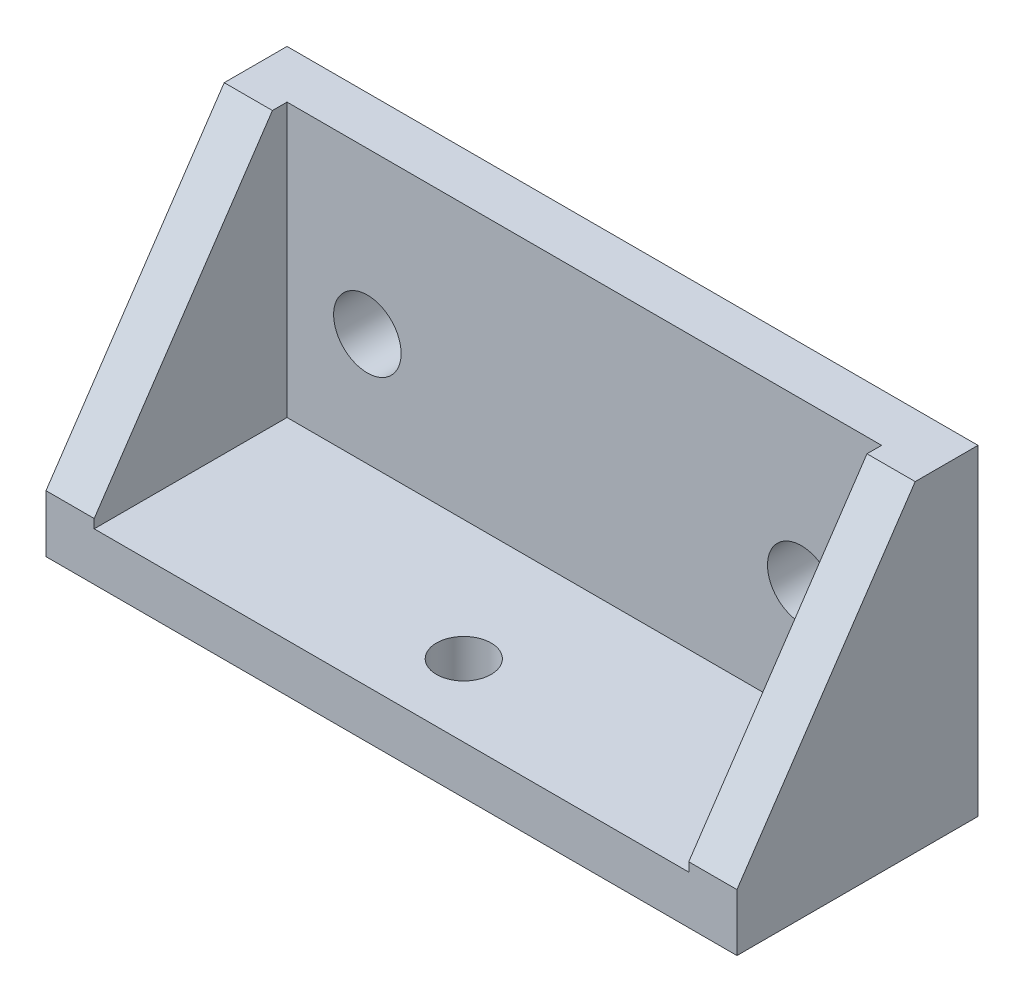
ISO-10303-21;
HEADER;
FILE_DESCRIPTION(('STEP AP214'),'2;1');
FILE_NAME('part.step','',(''),(''),'','','');
FILE_SCHEMA(('AUTOMOTIVE_DESIGN { 1 0 10303 214 1 1 1 1 }'));
ENDSEC;
DATA;
#1=APPLICATION_CONTEXT('core data for automotive mechanical design processes');
#2=APPLICATION_PROTOCOL_DEFINITION('international standard','automotive_design',2000,#1);
#3=PRODUCT_CONTEXT('',#1,'mechanical');
#4=PRODUCT('Part','Part','',(#3));
#5=PRODUCT_RELATED_PRODUCT_CATEGORY('part','',(#4));
#6=PRODUCT_DEFINITION_FORMATION('','',#4);
#7=PRODUCT_DEFINITION_CONTEXT('part definition',#1,'design');
#8=PRODUCT_DEFINITION('design','',#6,#7);
#9=PRODUCT_DEFINITION_SHAPE('','',#8);
#10=(LENGTH_UNIT() NAMED_UNIT(*) SI_UNIT(.MILLI.,.METRE.));
#11=(NAMED_UNIT(*) PLANE_ANGLE_UNIT() SI_UNIT($,.RADIAN.));
#12=(NAMED_UNIT(*) SI_UNIT($,.STERADIAN.) SOLID_ANGLE_UNIT());
#13=UNCERTAINTY_MEASURE_WITH_UNIT(LENGTH_MEASURE(1.E-05),#10,'distance_accuracy_value','');
#14=(GEOMETRIC_REPRESENTATION_CONTEXT(3) GLOBAL_UNCERTAINTY_ASSIGNED_CONTEXT((#13)) GLOBAL_UNIT_ASSIGNED_CONTEXT((#10,
#11,#12)) REPRESENTATION_CONTEXT('',''));
#15=CARTESIAN_POINT('',(0.,0.,0.));
#16=DIRECTION('',(0.,0.,1.));
#17=DIRECTION('',(1.,0.,0.));
#18=AXIS2_PLACEMENT_3D('',#15,#16,#17);
#19=CARTESIAN_POINT('',(21.5,20.,3.90885));
#20=DIRECTION('',(0.,-0.559192811985604,-0.829037634262542));
#21=DIRECTION('',(0.,0.829037634262542,-0.559192811985604));
#22=AXIS2_PLACEMENT_3D('',#19,#20,#21);
#23=PLANE('',#22);
#24=DIRECTION('',(-1.,0.,0.));
#25=VECTOR('',#24,1.);
#26=CARTESIAN_POINT('',(21.5,3.55669,15.));
#27=LINE('',#26,#25);
#28=CARTESIAN_POINT('',(-18.5,3.55669,15.));
#29=VERTEX_POINT('',#28);
#30=CARTESIAN_POINT('',(-21.5,3.55669,15.));
#31=VERTEX_POINT('',#30);
#32=EDGE_CURVE('E111',#29,#31,#27,.T.);
#33=ORIENTED_EDGE('',*,*,#32,.F.);
#34=DIRECTION('',(0.,0.829037634262542,-0.559192811985604));
#35=VECTOR('',#34,1.);
#36=CARTESIAN_POINT('',(-18.5,20.,3.90885));
#37=LINE('',#36,#35);
#38=CARTESIAN_POINT('',(-18.5,20.,3.90885));
#39=VERTEX_POINT('',#38);
#40=EDGE_CURVE('E124',#29,#39,#37,.T.);
#41=ORIENTED_EDGE('',*,*,#40,.T.);
#42=DIRECTION('',(-1.,0.,0.));
#43=VECTOR('',#42,1.);
#44=CARTESIAN_POINT('',(21.5,20.,3.90885));
#45=LINE('',#44,#43);
#46=CARTESIAN_POINT('',(-21.5,20.,3.90885));
#47=VERTEX_POINT('',#46);
#48=EDGE_CURVE('E40',#39,#47,#45,.T.);
#49=ORIENTED_EDGE('',*,*,#48,.T.);
#50=DIRECTION('',(0.,-0.829037634262543,0.559192811985604));
#51=VECTOR('',#50,1.);
#52=CARTESIAN_POINT('',(-21.5,20.,3.90885));
#53=LINE('',#52,#51);
#54=EDGE_CURVE('E123',#47,#31,#53,.T.);
#55=ORIENTED_EDGE('',*,*,#54,.T.);
#56=EDGE_LOOP('',(#33,#41,#49,#55));
#57=FACE_BOUND('',#56,.T.);
#58=ADVANCED_FACE('F32',(#57),#23,.F.);
#59=CARTESIAN_POINT('',(21.5,20.,0.));
#60=DIRECTION('',(0.,-1.,0.));
#61=DIRECTION('',(0.,0.,-1.));
#62=AXIS2_PLACEMENT_3D('',#59,#60,#61);
#63=PLANE('',#62);
#64=ORIENTED_EDGE('',*,*,#48,.F.);
#65=DIRECTION('',(0.,0.,1.));
#66=VECTOR('',#65,1.);
#67=CARTESIAN_POINT('',(-18.5,20.,3.));
#68=LINE('',#67,#66);
#69=CARTESIAN_POINT('',(-18.5,20.,3.));
#70=VERTEX_POINT('',#69);
#71=EDGE_CURVE('E174',#70,#39,#68,.T.);
#72=ORIENTED_EDGE('',*,*,#71,.F.);
#73=DIRECTION('',(-1.,0.,0.));
#74=VECTOR('',#73,1.);
#75=CARTESIAN_POINT('',(-18.5,20.,3.));
#76=LINE('',#75,#74);
#77=CARTESIAN_POINT('',(18.5,20.,3.));
#78=VERTEX_POINT('',#77);
#79=EDGE_CURVE('E168',#78,#70,#76,.T.);
#80=ORIENTED_EDGE('',*,*,#79,.F.);
#81=DIRECTION('',(0.,0.,-1.));
#82=VECTOR('',#81,1.);
#83=CARTESIAN_POINT('',(18.5,20.,3.));
#84=LINE('',#83,#82);
#85=CARTESIAN_POINT('',(18.5,20.,3.90885));
#86=VERTEX_POINT('',#85);
#87=EDGE_CURVE('E171',#86,#78,#84,.T.);
#88=ORIENTED_EDGE('',*,*,#87,.F.);
#89=CARTESIAN_POINT('',(21.5,20.,3.90885));
#90=VERTEX_POINT('',#89);
#91=EDGE_CURVE('E11',#90,#86,#45,.T.);
#92=ORIENTED_EDGE('',*,*,#91,.F.);
#93=DIRECTION('',(0.,0.,1.));
#94=VECTOR('',#93,1.);
#95=CARTESIAN_POINT('',(21.5,20.,0.));
#96=LINE('',#95,#94);
#97=CARTESIAN_POINT('',(21.5,20.,0.));
#98=VERTEX_POINT('',#97);
#99=EDGE_CURVE('E131',#98,#90,#96,.T.);
#100=ORIENTED_EDGE('',*,*,#99,.F.);
#101=DIRECTION('',(-1.,0.,0.));
#102=VECTOR('',#101,1.);
#103=CARTESIAN_POINT('',(21.5,20.,0.));
#104=LINE('',#103,#102);
#105=CARTESIAN_POINT('',(-21.5,20.,0.));
#106=VERTEX_POINT('',#105);
#107=EDGE_CURVE('E116',#98,#106,#104,.T.);
#108=ORIENTED_EDGE('',*,*,#107,.T.);
#109=DIRECTION('',(0.,0.,1.));
#110=VECTOR('',#109,1.);
#111=CARTESIAN_POINT('',(-21.5,20.,0.));
#112=LINE('',#111,#110);
#113=EDGE_CURVE('E120',#106,#47,#112,.T.);
#114=ORIENTED_EDGE('',*,*,#113,.T.);
#115=EDGE_LOOP('',(#64,#72,#80,#88,#92,#100,#108,#114));
#116=FACE_BOUND('',#115,.T.);
#117=ADVANCED_FACE('F34',(#116),#63,.F.);
#118=ORIENTED_EDGE('',*,*,#91,.T.);
#119=DIRECTION('',(0.,-0.829037634262542,0.559192811985604));
#120=VECTOR('',#119,1.);
#121=CARTESIAN_POINT('',(18.5,20.,3.90885));
#122=LINE('',#121,#120);
#123=CARTESIAN_POINT('',(18.5,3.55669,15.));
#124=VERTEX_POINT('',#123);
#125=EDGE_CURVE('E154',#86,#124,#122,.T.);
#126=ORIENTED_EDGE('',*,*,#125,.T.);
#127=CARTESIAN_POINT('',(21.5,3.55669,15.));
#128=VERTEX_POINT('',#127);
#129=EDGE_CURVE('E133',#128,#124,#27,.T.);
#130=ORIENTED_EDGE('',*,*,#129,.F.);
#131=DIRECTION('',(0.,-0.829037634262543,0.559192811985604));
#132=VECTOR('',#131,1.);
#133=CARTESIAN_POINT('',(21.5,20.,3.90885));
#134=LINE('',#133,#132);
#135=EDGE_CURVE('E88',#90,#128,#134,.T.);
#136=ORIENTED_EDGE('',*,*,#135,.F.);
#137=EDGE_LOOP('',(#118,#126,#130,#136));
#138=FACE_BOUND('',#137,.T.);
#139=ADVANCED_FACE('F226',(#138),#23,.F.);
#140=CARTESIAN_POINT('',(21.5,3.55669,15.));
#141=DIRECTION('',(0.,0.,-1.));
#142=DIRECTION('',(-1.,0.,0.));
#143=AXIS2_PLACEMENT_3D('',#140,#141,#142);
#144=PLANE('',#143);
#145=DIRECTION('',(1.,0.,0.));
#146=VECTOR('',#145,1.);
#147=CARTESIAN_POINT('',(-18.5,2.99999999999999,15.));
#148=LINE('',#147,#146);
#149=CARTESIAN_POINT('',(-18.5,2.99999999999999,15.));
#150=VERTEX_POINT('',#149);
#151=CARTESIAN_POINT('',(18.5,2.99999999999999,15.));
#152=VERTEX_POINT('',#151);
#153=EDGE_CURVE('E182',#150,#152,#148,.T.);
#154=ORIENTED_EDGE('',*,*,#153,.F.);
#155=DIRECTION('',(0.,1.,0.));
#156=VECTOR('',#155,1.);
#157=CARTESIAN_POINT('',(-18.5,2.99999999999999,15.));
#158=LINE('',#157,#156);
#159=EDGE_CURVE('E138',#150,#29,#158,.T.);
#160=ORIENTED_EDGE('',*,*,#159,.T.);
#161=ORIENTED_EDGE('',*,*,#32,.T.);
#162=DIRECTION('',(0.,-1.,0.));
#163=VECTOR('',#162,1.);
#164=CARTESIAN_POINT('',(-21.5,3.55669,15.));
#165=LINE('',#164,#163);
#166=CARTESIAN_POINT('',(-21.5,0.,15.));
#167=VERTEX_POINT('',#166);
#168=EDGE_CURVE('E108',#31,#167,#165,.T.);
#169=ORIENTED_EDGE('',*,*,#168,.T.);
#170=DIRECTION('',(-1.,0.,0.));
#171=VECTOR('',#170,1.);
#172=CARTESIAN_POINT('',(21.5,0.,15.));
#173=LINE('',#172,#171);
#174=CARTESIAN_POINT('',(21.5,0.,15.));
#175=VERTEX_POINT('',#174);
#176=EDGE_CURVE('E104',#175,#167,#173,.T.);
#177=ORIENTED_EDGE('',*,*,#176,.F.);
#178=DIRECTION('',(0.,-1.,0.));
#179=VECTOR('',#178,1.);
#180=CARTESIAN_POINT('',(21.5,3.55669,15.));
#181=LINE('',#180,#179);
#182=EDGE_CURVE('E94',#128,#175,#181,.T.);
#183=ORIENTED_EDGE('',*,*,#182,.F.);
#184=ORIENTED_EDGE('',*,*,#129,.T.);
#185=DIRECTION('',(0.,1.,0.));
#186=VECTOR('',#185,1.);
#187=CARTESIAN_POINT('',(18.5,2.99999999999999,15.));
#188=LINE('',#187,#186);
#189=EDGE_CURVE('E159',#152,#124,#188,.T.);
#190=ORIENTED_EDGE('',*,*,#189,.F.);
#191=EDGE_LOOP('',(#154,#160,#161,#169,#177,#183,#184,#190));
#192=FACE_BOUND('',#191,.T.);
#193=ADVANCED_FACE('F106',(#192),#144,.F.);
#194=CARTESIAN_POINT('',(21.5,0.,15.));
#195=DIRECTION('',(0.,1.,0.));
#196=DIRECTION('',(0.,0.,1.));
#197=AXIS2_PLACEMENT_3D('',#194,#195,#196);
#198=PLANE('',#197);
#199=CARTESIAN_POINT('',(0.,0.,10.5));
#200=DIRECTION('',(0.,1.,0.));
#201=DIRECTION('',(0.,0.,1.));
#202=AXIS2_PLACEMENT_3D('',#199,#200,#201);
#203=CIRCLE('',#202,1.7);
#204=CARTESIAN_POINT('',(0.,0.,12.2));
#205=VERTEX_POINT('',#204);
#206=EDGE_CURVE('E194',#205,#205,#203,.T.);
#207=ORIENTED_EDGE('',*,*,#206,.T.);
#208=EDGE_LOOP('',(#207));
#209=FACE_BOUND('',#208,.T.);
#210=DIRECTION('',(0.,0.,-1.));
#211=VECTOR('',#210,1.);
#212=CARTESIAN_POINT('',(-21.5,0.,15.));
#213=LINE('',#212,#211);
#214=CARTESIAN_POINT('',(-21.5,0.,0.));
#215=VERTEX_POINT('',#214);
#216=EDGE_CURVE('E128',#167,#215,#213,.T.);
#217=ORIENTED_EDGE('',*,*,#216,.T.);
#218=DIRECTION('',(-1.,0.,0.));
#219=VECTOR('',#218,1.);
#220=CARTESIAN_POINT('',(21.5,0.,0.));
#221=LINE('',#220,#219);
#222=CARTESIAN_POINT('',(21.5,0.,0.));
#223=VERTEX_POINT('',#222);
#224=EDGE_CURVE('E112',#223,#215,#221,.T.);
#225=ORIENTED_EDGE('',*,*,#224,.F.);
#226=DIRECTION('',(0.,0.,-1.));
#227=VECTOR('',#226,1.);
#228=CARTESIAN_POINT('',(21.5,0.,15.));
#229=LINE('',#228,#227);
#230=EDGE_CURVE('E98',#175,#223,#229,.T.);
#231=ORIENTED_EDGE('',*,*,#230,.F.);
#232=ORIENTED_EDGE('',*,*,#176,.T.);
#233=EDGE_LOOP('',(#217,#225,#231,#232));
#234=FACE_BOUND('',#233,.T.);
#235=ADVANCED_FACE('F114',(#209,#234),#198,.F.);
#236=CARTESIAN_POINT('',(21.5,0.,0.));
#237=DIRECTION('',(0.,0.,1.));
#238=DIRECTION('',(1.,0.,0.));
#239=AXIS2_PLACEMENT_3D('',#236,#237,#238);
#240=PLANE('',#239);
#241=CARTESIAN_POINT('',(13.5,10.,0.));
#242=DIRECTION('',(0.,0.,1.));
#243=DIRECTION('',(1.,0.,0.));
#244=AXIS2_PLACEMENT_3D('',#241,#242,#243);
#245=CIRCLE('',#244,2.1);
#246=CARTESIAN_POINT('',(15.6,10.,0.));
#247=VERTEX_POINT('',#246);
#248=EDGE_CURVE('E188',#247,#247,#245,.T.);
#249=ORIENTED_EDGE('',*,*,#248,.T.);
#250=EDGE_LOOP('',(#249));
#251=FACE_BOUND('',#250,.T.);
#252=CARTESIAN_POINT('',(-13.5,10.,0.));
#253=DIRECTION('',(0.,0.,1.));
#254=DIRECTION('',(1.,0.,0.));
#255=AXIS2_PLACEMENT_3D('',#252,#253,#254);
#256=CIRCLE('',#255,2.1);
#257=CARTESIAN_POINT('',(-11.4,10.,0.));
#258=VERTEX_POINT('',#257);
#259=EDGE_CURVE('E177',#258,#258,#256,.T.);
#260=ORIENTED_EDGE('',*,*,#259,.T.);
#261=EDGE_LOOP('',(#260));
#262=FACE_BOUND('',#261,.T.);
#263=DIRECTION('',(0.,1.,0.));
#264=VECTOR('',#263,1.);
#265=CARTESIAN_POINT('',(-21.5,0.,0.));
#266=LINE('',#265,#264);
#267=EDGE_CURVE('E80',#215,#106,#266,.T.);
#268=ORIENTED_EDGE('',*,*,#267,.T.);
#269=ORIENTED_EDGE('',*,*,#107,.F.);
#270=DIRECTION('',(0.,1.,0.));
#271=VECTOR('',#270,1.);
#272=CARTESIAN_POINT('',(21.5,0.,0.));
#273=LINE('',#272,#271);
#274=EDGE_CURVE('E56',#223,#98,#273,.T.);
#275=ORIENTED_EDGE('',*,*,#274,.F.);
#276=ORIENTED_EDGE('',*,*,#224,.T.);
#277=EDGE_LOOP('',(#268,#269,#275,#276));
#278=FACE_BOUND('',#277,.T.);
#279=ADVANCED_FACE('F146',(#251,#262,#278),#240,.F.);
#280=CARTESIAN_POINT('',(21.5,0.,0.));
#281=DIRECTION('',(1.,0.,0.));
#282=DIRECTION('',(0.,0.,-1.));
#283=AXIS2_PLACEMENT_3D('',#280,#281,#282);
#284=PLANE('',#283);
#285=ORIENTED_EDGE('',*,*,#99,.T.);
#286=ORIENTED_EDGE('',*,*,#135,.T.);
#287=ORIENTED_EDGE('',*,*,#182,.T.);
#288=ORIENTED_EDGE('',*,*,#230,.T.);
#289=ORIENTED_EDGE('',*,*,#274,.T.);
#290=EDGE_LOOP('',(#285,#286,#287,#288,#289));
#291=FACE_BOUND('',#290,.T.);
#292=ADVANCED_FACE('F96',(#291),#284,.T.);
#293=CARTESIAN_POINT('',(-21.5,0.,0.));
#294=DIRECTION('',(1.,0.,0.));
#295=DIRECTION('',(0.,0.,-1.));
#296=AXIS2_PLACEMENT_3D('',#293,#294,#295);
#297=PLANE('',#296);
#298=ORIENTED_EDGE('',*,*,#113,.F.);
#299=ORIENTED_EDGE('',*,*,#267,.F.);
#300=ORIENTED_EDGE('',*,*,#216,.F.);
#301=ORIENTED_EDGE('',*,*,#168,.F.);
#302=ORIENTED_EDGE('',*,*,#54,.F.);
#303=EDGE_LOOP('',(#298,#299,#300,#301,#302));
#304=FACE_BOUND('',#303,.T.);
#305=ADVANCED_FACE('F145',(#304),#297,.F.);
#306=CARTESIAN_POINT('',(-18.5,3.,2.99999999999998));
#307=DIRECTION('',(-1.,0.,0.));
#308=DIRECTION('',(0.,0.,1.));
#309=AXIS2_PLACEMENT_3D('',#306,#307,#308);
#310=PLANE('',#309);
#311=ORIENTED_EDGE('',*,*,#159,.F.);
#312=DIRECTION('',(0.,0.,1.));
#313=VECTOR('',#312,1.);
#314=CARTESIAN_POINT('',(-18.5,3.,2.99999999999998));
#315=LINE('',#314,#313);
#316=CARTESIAN_POINT('',(-18.5,3.,2.99999999999998));
#317=VERTEX_POINT('',#316);
#318=EDGE_CURVE('E47',#317,#150,#315,.T.);
#319=ORIENTED_EDGE('',*,*,#318,.F.);
#320=DIRECTION('',(0.,1.,0.));
#321=VECTOR('',#320,1.);
#322=CARTESIAN_POINT('',(-18.5,3.,2.99999999999998));
#323=LINE('',#322,#321);
#324=EDGE_CURVE('E157',#317,#70,#323,.T.);
#325=ORIENTED_EDGE('',*,*,#324,.T.);
#326=ORIENTED_EDGE('',*,*,#71,.T.);
#327=ORIENTED_EDGE('',*,*,#40,.F.);
#328=EDGE_LOOP('',(#311,#319,#325,#326,#327));
#329=FACE_BOUND('',#328,.T.);
#330=ADVANCED_FACE('F251',(#329),#310,.F.);
#331=CARTESIAN_POINT('',(18.5,3.,2.99999999999998));
#332=DIRECTION('',(1.,0.,0.));
#333=DIRECTION('',(0.,0.,-1.));
#334=AXIS2_PLACEMENT_3D('',#331,#332,#333);
#335=PLANE('',#334);
#336=ORIENTED_EDGE('',*,*,#87,.T.);
#337=DIRECTION('',(0.,1.,0.));
#338=VECTOR('',#337,1.);
#339=CARTESIAN_POINT('',(18.5,3.,2.99999999999998));
#340=LINE('',#339,#338);
#341=CARTESIAN_POINT('',(18.5,3.,2.99999999999998));
#342=VERTEX_POINT('',#341);
#343=EDGE_CURVE('E163',#342,#78,#340,.T.);
#344=ORIENTED_EDGE('',*,*,#343,.F.);
#345=DIRECTION('',(0.,0.,-1.));
#346=VECTOR('',#345,1.);
#347=CARTESIAN_POINT('',(18.5,3.,2.99999999999998));
#348=LINE('',#347,#346);
#349=EDGE_CURVE('E179',#152,#342,#348,.T.);
#350=ORIENTED_EDGE('',*,*,#349,.F.);
#351=ORIENTED_EDGE('',*,*,#189,.T.);
#352=ORIENTED_EDGE('',*,*,#125,.F.);
#353=EDGE_LOOP('',(#336,#344,#350,#351,#352));
#354=FACE_BOUND('',#353,.T.);
#355=ADVANCED_FACE('F222',(#354),#335,.F.);
#356=CARTESIAN_POINT('',(-18.5,3.,2.99999999999998));
#357=DIRECTION('',(0.,0.,-1.));
#358=DIRECTION('',(0.,1.,0.));
#359=AXIS2_PLACEMENT_3D('',#356,#357,#358);
#360=PLANE('',#359);
#361=CARTESIAN_POINT('',(13.5,10.,2.99999999999998));
#362=DIRECTION('',(0.,0.,1.));
#363=DIRECTION('',(1.,0.,0.));
#364=AXIS2_PLACEMENT_3D('',#361,#362,#363);
#365=CIRCLE('',#364,2.1);
#366=CARTESIAN_POINT('',(15.6,10.,2.99999999999998));
#367=VERTEX_POINT('',#366);
#368=EDGE_CURVE('E191',#367,#367,#365,.T.);
#369=ORIENTED_EDGE('',*,*,#368,.F.);
#370=EDGE_LOOP('',(#369));
#371=FACE_BOUND('',#370,.T.);
#372=CARTESIAN_POINT('',(-13.5,10.,2.99999999999998));
#373=DIRECTION('',(0.,0.,1.));
#374=DIRECTION('',(1.,0.,0.));
#375=AXIS2_PLACEMENT_3D('',#372,#373,#374);
#376=CIRCLE('',#375,2.1);
#377=CARTESIAN_POINT('',(-11.4,10.,2.99999999999998));
#378=VERTEX_POINT('',#377);
#379=EDGE_CURVE('E185',#378,#378,#376,.T.);
#380=ORIENTED_EDGE('',*,*,#379,.F.);
#381=EDGE_LOOP('',(#380));
#382=FACE_BOUND('',#381,.T.);
#383=ORIENTED_EDGE('',*,*,#79,.T.);
#384=ORIENTED_EDGE('',*,*,#324,.F.);
#385=DIRECTION('',(-1.,0.,0.));
#386=VECTOR('',#385,1.);
#387=CARTESIAN_POINT('',(-18.5,3.,2.99999999999998));
#388=LINE('',#387,#386);
#389=EDGE_CURVE('E160',#342,#317,#388,.T.);
#390=ORIENTED_EDGE('',*,*,#389,.F.);
#391=ORIENTED_EDGE('',*,*,#343,.T.);
#392=EDGE_LOOP('',(#383,#384,#390,#391));
#393=FACE_BOUND('',#392,.T.);
#394=ADVANCED_FACE('F214',(#371,#382,#393),#360,.F.);
#395=CARTESIAN_POINT('',(0.,3.,0.));
#396=DIRECTION('',(0.,1.,0.));
#397=DIRECTION('',(0.,0.,1.));
#398=AXIS2_PLACEMENT_3D('',#395,#396,#397);
#399=PLANE('',#398);
#400=CARTESIAN_POINT('',(0.,2.99999999999999,10.5));
#401=DIRECTION('',(0.,1.,0.));
#402=DIRECTION('',(0.,0.,1.));
#403=AXIS2_PLACEMENT_3D('',#400,#401,#402);
#404=CIRCLE('',#403,1.7);
#405=CARTESIAN_POINT('',(0.,2.99999999999999,12.2));
#406=VERTEX_POINT('',#405);
#407=EDGE_CURVE('E197',#406,#406,#404,.T.);
#408=ORIENTED_EDGE('',*,*,#407,.F.);
#409=EDGE_LOOP('',(#408));
#410=FACE_BOUND('',#409,.T.);
#411=ORIENTED_EDGE('',*,*,#318,.T.);
#412=ORIENTED_EDGE('',*,*,#153,.T.);
#413=ORIENTED_EDGE('',*,*,#349,.T.);
#414=ORIENTED_EDGE('',*,*,#389,.T.);
#415=EDGE_LOOP('',(#411,#412,#413,#414));
#416=FACE_BOUND('',#415,.T.);
#417=ADVANCED_FACE('F211',(#410,#416),#399,.T.);
#418=CARTESIAN_POINT('',(-13.5,10.,0.));
#419=DIRECTION('',(0.,0.,1.));
#420=DIRECTION('',(1.,0.,0.));
#421=AXIS2_PLACEMENT_3D('',#418,#419,#420);
#422=CYLINDRICAL_SURFACE('',#421,2.1);
#423=ORIENTED_EDGE('',*,*,#259,.F.);
#424=EDGE_LOOP('',(#423));
#425=FACE_BOUND('',#424,.T.);
#426=ORIENTED_EDGE('',*,*,#379,.T.);
#427=EDGE_LOOP('',(#426));
#428=FACE_BOUND('',#427,.T.);
#429=ADVANCED_FACE('F213',(#425,#428),#422,.F.);
#430=CARTESIAN_POINT('',(13.5,10.,0.));
#431=DIRECTION('',(0.,0.,1.));
#432=DIRECTION('',(1.,0.,0.));
#433=AXIS2_PLACEMENT_3D('',#430,#431,#432);
#434=CYLINDRICAL_SURFACE('',#433,2.1);
#435=ORIENTED_EDGE('',*,*,#248,.F.);
#436=EDGE_LOOP('',(#435));
#437=FACE_BOUND('',#436,.T.);
#438=ORIENTED_EDGE('',*,*,#368,.T.);
#439=EDGE_LOOP('',(#438));
#440=FACE_BOUND('',#439,.T.);
#441=ADVANCED_FACE('F207',(#437,#440),#434,.F.);
#442=CARTESIAN_POINT('',(0.,0.,10.5));
#443=DIRECTION('',(0.,1.,0.));
#444=DIRECTION('',(0.,0.,1.));
#445=AXIS2_PLACEMENT_3D('',#442,#443,#444);
#446=CYLINDRICAL_SURFACE('',#445,1.7);
#447=ORIENTED_EDGE('',*,*,#206,.F.);
#448=EDGE_LOOP('',(#447));
#449=FACE_BOUND('',#448,.T.);
#450=ORIENTED_EDGE('',*,*,#407,.T.);
#451=EDGE_LOOP('',(#450));
#452=FACE_BOUND('',#451,.T.);
#453=ADVANCED_FACE('F204',(#449,#452),#446,.F.);
#454=CLOSED_SHELL('',(#58,#117,#139,#193,#235,#279,#292,#305,#330,#355,#394,#417,#429,#441,#453));
#455=MANIFOLD_SOLID_BREP('B2',#454);
#456=ADVANCED_BREP_SHAPE_REPRESENTATION('',(#18,#455),#14);
#457=SHAPE_DEFINITION_REPRESENTATION(#9,#456);
ENDSEC;
END-ISO-10303-21;
